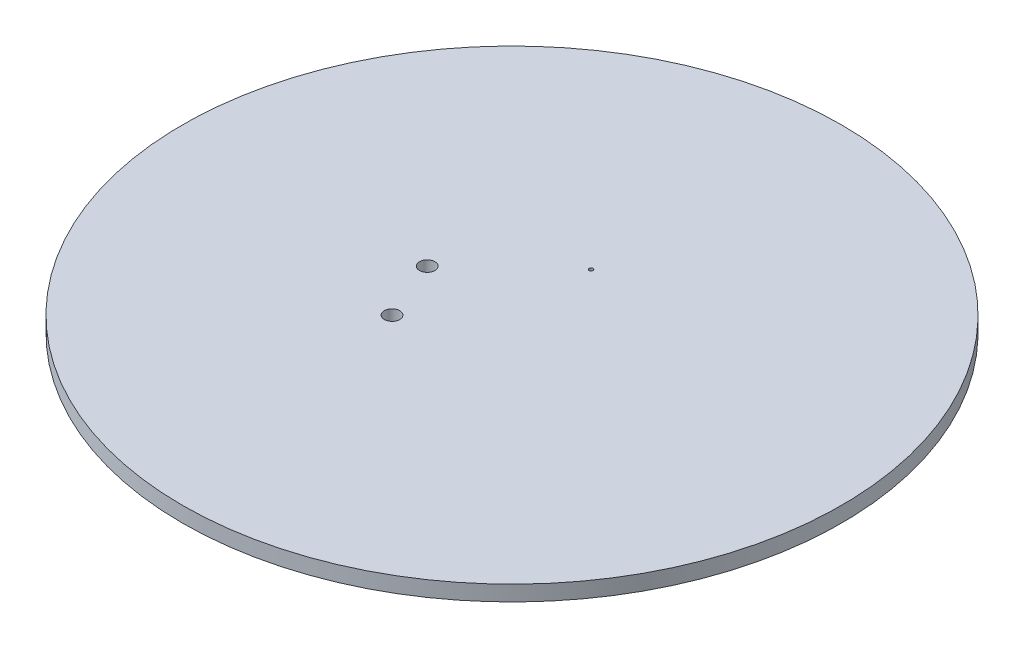
ISO-10303-21;
HEADER;
FILE_DESCRIPTION(('STEP AP214'),'2;1');
FILE_NAME('part.step','',(''),(''),'','','');
FILE_SCHEMA(('AUTOMOTIVE_DESIGN { 1 0 10303 214 1 1 1 1 }'));
ENDSEC;
DATA;
#1=APPLICATION_CONTEXT('core data for automotive mechanical design processes');
#2=APPLICATION_PROTOCOL_DEFINITION('international standard','automotive_design',2000,#1);
#3=PRODUCT_CONTEXT('',#1,'mechanical');
#4=PRODUCT('Part','Part','',(#3));
#5=PRODUCT_RELATED_PRODUCT_CATEGORY('part','',(#4));
#6=PRODUCT_DEFINITION_FORMATION('','',#4);
#7=PRODUCT_DEFINITION_CONTEXT('part definition',#1,'design');
#8=PRODUCT_DEFINITION('design','',#6,#7);
#9=PRODUCT_DEFINITION_SHAPE('','',#8);
#10=(LENGTH_UNIT() NAMED_UNIT(*) SI_UNIT(.MILLI.,.METRE.));
#11=(NAMED_UNIT(*) PLANE_ANGLE_UNIT() SI_UNIT($,.RADIAN.));
#12=(NAMED_UNIT(*) SI_UNIT($,.STERADIAN.) SOLID_ANGLE_UNIT());
#13=UNCERTAINTY_MEASURE_WITH_UNIT(LENGTH_MEASURE(1.E-05),#10,'distance_accuracy_value','');
#14=(GEOMETRIC_REPRESENTATION_CONTEXT(3) GLOBAL_UNCERTAINTY_ASSIGNED_CONTEXT((#13)) GLOBAL_UNIT_ASSIGNED_CONTEXT((#10,
#11,#12)) REPRESENTATION_CONTEXT('',''));
#15=CARTESIAN_POINT('',(0.,0.,0.));
#16=DIRECTION('',(0.,0.,1.));
#17=DIRECTION('',(1.,0.,0.));
#18=AXIS2_PLACEMENT_3D('',#15,#16,#17);
#19=CARTESIAN_POINT('',(0.,2.,0.));
#20=DIRECTION('',(0.,-1.,0.));
#21=DIRECTION('',(0.,0.,-1.));
#22=AXIS2_PLACEMENT_3D('',#19,#20,#21);
#23=CYLINDRICAL_SURFACE('',#22,42.73);
#24=CARTESIAN_POINT('',(0.,2.,0.));
#25=DIRECTION('',(0.,1.,0.));
#26=DIRECTION('',(0.,0.,1.));
#27=AXIS2_PLACEMENT_3D('',#24,#25,#26);
#28=CIRCLE('',#27,42.73);
#29=CARTESIAN_POINT('',(0.,2.,42.73));
#30=VERTEX_POINT('',#29);
#31=EDGE_CURVE('E10',#30,#30,#28,.T.);
#32=ORIENTED_EDGE('',*,*,#31,.F.);
#33=EDGE_LOOP('',(#32));
#34=FACE_BOUND('',#33,.T.);
#35=CARTESIAN_POINT('',(0.,0.,0.));
#36=DIRECTION('',(0.,1.,0.));
#37=DIRECTION('',(0.,0.,1.));
#38=AXIS2_PLACEMENT_3D('',#35,#36,#37);
#39=CIRCLE('',#38,42.73);
#40=CARTESIAN_POINT('',(0.,0.,42.73));
#41=VERTEX_POINT('',#40);
#42=EDGE_CURVE('E33',#41,#41,#39,.T.);
#43=ORIENTED_EDGE('',*,*,#42,.T.);
#44=EDGE_LOOP('',(#43));
#45=FACE_BOUND('',#44,.T.);
#46=ADVANCED_FACE('F30',(#34,#45),#23,.T.);
#47=CARTESIAN_POINT('',(0.,2.,0.));
#48=DIRECTION('',(0.,1.,0.));
#49=DIRECTION('',(0.,0.,1.));
#50=AXIS2_PLACEMENT_3D('',#47,#48,#49);
#51=PLANE('',#50);
#52=CARTESIAN_POINT('',(-11.,2.,0.));
#53=DIRECTION('',(0.,1.,0.));
#54=DIRECTION('',(0.,0.,1.));
#55=AXIS2_PLACEMENT_3D('',#52,#53,#54);
#56=CIRCLE('',#55,1.);
#57=CARTESIAN_POINT('',(-11.,2.,1.));
#58=VERTEX_POINT('',#57);
#59=EDGE_CURVE('E47',#58,#58,#56,.T.);
#60=ORIENTED_EDGE('',*,*,#59,.F.);
#61=EDGE_LOOP('',(#60));
#62=FACE_BOUND('',#61,.T.);
#63=CARTESIAN_POINT('',(-7.77817459305202,2.,7.77817459305202));
#64=DIRECTION('',(0.,1.,0.));
#65=DIRECTION('',(0.,0.,1.));
#66=AXIS2_PLACEMENT_3D('',#63,#64,#65);
#67=CIRCLE('',#66,1.);
#68=CARTESIAN_POINT('',(-7.77817459305202,2.,8.77817459305202));
#69=VERTEX_POINT('',#68);
#70=EDGE_CURVE('E50',#69,#69,#67,.T.);
#71=ORIENTED_EDGE('',*,*,#70,.F.);
#72=EDGE_LOOP('',(#71));
#73=FACE_BOUND('',#72,.T.);
#74=CARTESIAN_POINT('',(0.,2.,-10.25));
#75=DIRECTION('',(0.,1.,0.));
#76=DIRECTION('',(0.,0.,1.));
#77=AXIS2_PLACEMENT_3D('',#74,#75,#76);
#78=CIRCLE('',#77,0.25);
#79=CARTESIAN_POINT('',(0.,2.,-10.));
#80=VERTEX_POINT('',#79);
#81=EDGE_CURVE('E40',#80,#80,#78,.T.);
#82=ORIENTED_EDGE('',*,*,#81,.F.);
#83=EDGE_LOOP('',(#82));
#84=FACE_BOUND('',#83,.T.);
#85=ORIENTED_EDGE('',*,*,#31,.T.);
#86=EDGE_LOOP('',(#85));
#87=FACE_BOUND('',#86,.T.);
#88=ADVANCED_FACE('F75',(#62,#73,#84,#87),#51,.T.);
#89=CARTESIAN_POINT('',(0.,0.,0.));
#90=DIRECTION('',(0.,1.,0.));
#91=DIRECTION('',(0.,0.,1.));
#92=AXIS2_PLACEMENT_3D('',#89,#90,#91);
#93=PLANE('',#92);
#94=CARTESIAN_POINT('',(-11.,0.,0.));
#95=DIRECTION('',(0.,1.,0.));
#96=DIRECTION('',(0.,0.,1.));
#97=AXIS2_PLACEMENT_3D('',#94,#95,#96);
#98=CIRCLE('',#97,1.);
#99=CARTESIAN_POINT('',(-11.,0.,1.));
#100=VERTEX_POINT('',#99);
#101=EDGE_CURVE('E53',#100,#100,#98,.T.);
#102=ORIENTED_EDGE('',*,*,#101,.T.);
#103=EDGE_LOOP('',(#102));
#104=FACE_BOUND('',#103,.T.);
#105=CARTESIAN_POINT('',(-7.77817459305202,0.,7.77817459305202));
#106=DIRECTION('',(0.,1.,0.));
#107=DIRECTION('',(0.,0.,1.));
#108=AXIS2_PLACEMENT_3D('',#105,#106,#107);
#109=CIRCLE('',#108,1.);
#110=CARTESIAN_POINT('',(-7.77817459305202,0.,8.77817459305202));
#111=VERTEX_POINT('',#110);
#112=EDGE_CURVE('E54',#111,#111,#109,.T.);
#113=ORIENTED_EDGE('',*,*,#112,.T.);
#114=EDGE_LOOP('',(#113));
#115=FACE_BOUND('',#114,.T.);
#116=CARTESIAN_POINT('',(0.,0.,-10.25));
#117=DIRECTION('',(0.,1.,0.));
#118=DIRECTION('',(0.,0.,1.));
#119=AXIS2_PLACEMENT_3D('',#116,#117,#118);
#120=CIRCLE('',#119,0.25);
#121=CARTESIAN_POINT('',(0.,0.,-10.));
#122=VERTEX_POINT('',#121);
#123=EDGE_CURVE('E44',#122,#122,#120,.T.);
#124=ORIENTED_EDGE('',*,*,#123,.T.);
#125=EDGE_LOOP('',(#124));
#126=FACE_BOUND('',#125,.T.);
#127=ORIENTED_EDGE('',*,*,#42,.F.);
#128=EDGE_LOOP('',(#127));
#129=FACE_BOUND('',#128,.T.);
#130=ADVANCED_FACE('F60',(#104,#115,#126,#129),#93,.F.);
#131=CARTESIAN_POINT('',(0.,0.,-10.25));
#132=DIRECTION('',(0.,1.,0.));
#133=DIRECTION('',(0.,0.,1.));
#134=AXIS2_PLACEMENT_3D('',#131,#132,#133);
#135=CYLINDRICAL_SURFACE('',#134,0.25);
#136=ORIENTED_EDGE('',*,*,#81,.T.);
#137=EDGE_LOOP('',(#136));
#138=FACE_BOUND('',#137,.T.);
#139=ORIENTED_EDGE('',*,*,#123,.F.);
#140=EDGE_LOOP('',(#139));
#141=FACE_BOUND('',#140,.T.);
#142=ADVANCED_FACE('F71',(#138,#141),#135,.F.);
#143=CARTESIAN_POINT('',(-7.77817459305202,0.,7.77817459305202));
#144=DIRECTION('',(0.,1.,0.));
#145=DIRECTION('',(0.,0.,1.));
#146=AXIS2_PLACEMENT_3D('',#143,#144,#145);
#147=CYLINDRICAL_SURFACE('',#146,1.);
#148=ORIENTED_EDGE('',*,*,#70,.T.);
#149=EDGE_LOOP('',(#148));
#150=FACE_BOUND('',#149,.T.);
#151=ORIENTED_EDGE('',*,*,#112,.F.);
#152=EDGE_LOOP('',(#151));
#153=FACE_BOUND('',#152,.T.);
#154=ADVANCED_FACE('F65',(#150,#153),#147,.F.);
#155=CARTESIAN_POINT('',(-11.,0.,0.));
#156=DIRECTION('',(0.,1.,0.));
#157=DIRECTION('',(0.,0.,1.));
#158=AXIS2_PLACEMENT_3D('',#155,#156,#157);
#159=CYLINDRICAL_SURFACE('',#158,1.);
#160=ORIENTED_EDGE('',*,*,#59,.T.);
#161=EDGE_LOOP('',(#160));
#162=FACE_BOUND('',#161,.T.);
#163=ORIENTED_EDGE('',*,*,#101,.F.);
#164=EDGE_LOOP('',(#163));
#165=FACE_BOUND('',#164,.T.);
#166=ADVANCED_FACE('F63',(#162,#165),#159,.F.);
#167=CLOSED_SHELL('',(#46,#88,#130,#142,#154,#166));
#168=MANIFOLD_SOLID_BREP('B2',#167);
#169=ADVANCED_BREP_SHAPE_REPRESENTATION('',(#18,#168),#14);
#170=SHAPE_DEFINITION_REPRESENTATION(#9,#169);
ENDSEC;
END-ISO-10303-21;
